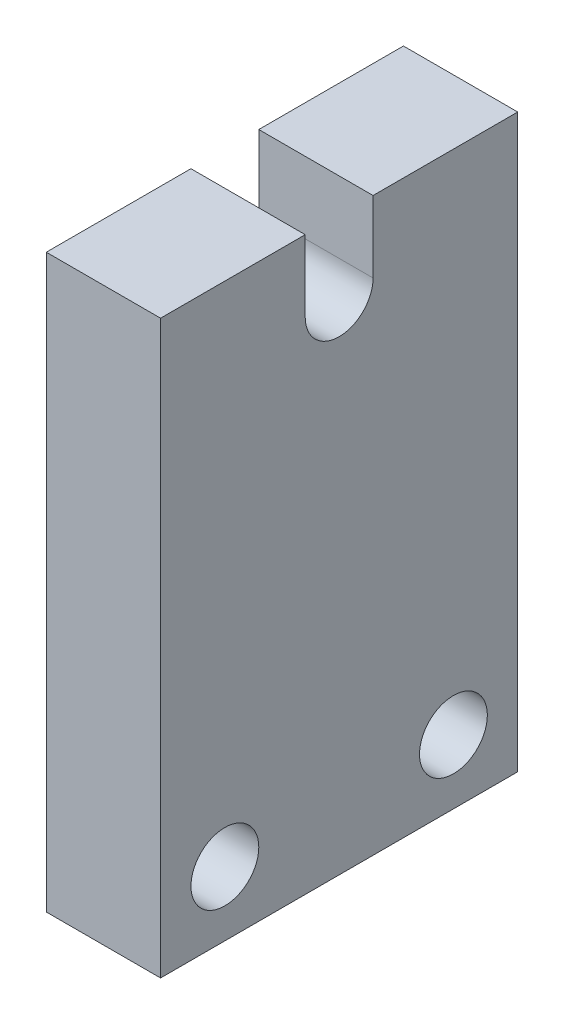
ISO-10303-21;
HEADER;
FILE_DESCRIPTION(('STEP AP214'),'2;1');
FILE_NAME('part.step','',(''),(''),'','','');
FILE_SCHEMA(('AUTOMOTIVE_DESIGN { 1 0 10303 214 1 1 1 1 }'));
ENDSEC;
DATA;
#1=APPLICATION_CONTEXT('core data for automotive mechanical design processes');
#2=APPLICATION_PROTOCOL_DEFINITION('international standard','automotive_design',2000,#1);
#3=PRODUCT_CONTEXT('',#1,'mechanical');
#4=PRODUCT('Part','Part','',(#3));
#5=PRODUCT_RELATED_PRODUCT_CATEGORY('part','',(#4));
#6=PRODUCT_DEFINITION_FORMATION('','',#4);
#7=PRODUCT_DEFINITION_CONTEXT('part definition',#1,'design');
#8=PRODUCT_DEFINITION('design','',#6,#7);
#9=PRODUCT_DEFINITION_SHAPE('','',#8);
#10=(LENGTH_UNIT() NAMED_UNIT(*) SI_UNIT(.MILLI.,.METRE.));
#11=(NAMED_UNIT(*) PLANE_ANGLE_UNIT() SI_UNIT($,.RADIAN.));
#12=(NAMED_UNIT(*) SI_UNIT($,.STERADIAN.) SOLID_ANGLE_UNIT());
#13=UNCERTAINTY_MEASURE_WITH_UNIT(LENGTH_MEASURE(1.E-05),#10,'distance_accuracy_value','');
#14=(GEOMETRIC_REPRESENTATION_CONTEXT(3) GLOBAL_UNCERTAINTY_ASSIGNED_CONTEXT((#13)) GLOBAL_UNIT_ASSIGNED_CONTEXT((#10,
#11,#12)) REPRESENTATION_CONTEXT('',''));
#15=CARTESIAN_POINT('',(0.,0.,0.));
#16=DIRECTION('',(0.,0.,1.));
#17=DIRECTION('',(1.,0.,0.));
#18=AXIS2_PLACEMENT_3D('',#15,#16,#17);
#19=CARTESIAN_POINT('',(8.,0.,0.));
#20=DIRECTION('',(1.,0.,0.));
#21=DIRECTION('',(0.,0.,-1.));
#22=AXIS2_PLACEMENT_3D('',#19,#20,#21);
#23=PLANE('',#22);
#24=CARTESIAN_POINT('',(8.,9.,16.));
#25=DIRECTION('',(1.,0.,0.));
#26=DIRECTION('',(0.,0.,-1.));
#27=AXIS2_PLACEMENT_3D('',#24,#25,#26);
#28=CIRCLE('',#27,4.75);
#29=CARTESIAN_POINT('',(8.,9.,11.25));
#30=VERTEX_POINT('',#29);
#31=EDGE_CURVE('E146',#30,#30,#28,.F.);
#32=ORIENTED_EDGE('',*,*,#31,.T.);
#33=EDGE_LOOP('',(#32));
#34=FACE_BOUND('',#33,.T.);
#35=CARTESIAN_POINT('',(8.,9.,-16.));
#36=DIRECTION('',(1.,0.,0.));
#37=DIRECTION('',(0.,0.,-1.));
#38=AXIS2_PLACEMENT_3D('',#35,#36,#37);
#39=CIRCLE('',#38,4.75);
#40=CARTESIAN_POINT('',(8.,9.,-20.75));
#41=VERTEX_POINT('',#40);
#42=EDGE_CURVE('E144',#41,#41,#39,.F.);
#43=ORIENTED_EDGE('',*,*,#42,.T.);
#44=EDGE_LOOP('',(#43));
#45=FACE_BOUND('',#44,.T.);
#46=DIRECTION('',(0.,1.,0.));
#47=VECTOR('',#46,1.);
#48=CARTESIAN_POINT('',(8.,70.,-4.75));
#49=LINE('',#48,#47);
#50=CARTESIAN_POINT('',(8.,80.,-4.75));
#51=VERTEX_POINT('',#50);
#52=CARTESIAN_POINT('',(8.,70.,-4.75));
#53=VERTEX_POINT('',#52);
#54=EDGE_CURVE('E48',#51,#53,#49,.F.);
#55=ORIENTED_EDGE('',*,*,#54,.T.);
#56=CARTESIAN_POINT('',(8.,70.,0.));
#57=DIRECTION('',(1.,0.,0.));
#58=DIRECTION('',(0.,0.,-1.));
#59=AXIS2_PLACEMENT_3D('',#56,#57,#58);
#60=CIRCLE('',#59,4.75);
#61=CARTESIAN_POINT('',(8.,70.,4.75));
#62=VERTEX_POINT('',#61);
#63=EDGE_CURVE('E20',#53,#62,#60,.F.);
#64=ORIENTED_EDGE('',*,*,#63,.T.);
#65=DIRECTION('',(0.,1.,0.));
#66=VECTOR('',#65,1.);
#67=CARTESIAN_POINT('',(8.,80.,4.75));
#68=LINE('',#67,#66);
#69=CARTESIAN_POINT('',(8.,80.,4.75));
#70=VERTEX_POINT('',#69);
#71=EDGE_CURVE('E95',#62,#70,#68,.T.);
#72=ORIENTED_EDGE('',*,*,#71,.T.);
#73=DIRECTION('',(0.,0.,1.));
#74=VECTOR('',#73,1.);
#75=CARTESIAN_POINT('',(8.,80.,-25.));
#76=LINE('',#75,#74);
#77=CARTESIAN_POINT('',(8.,80.,25.));
#78=VERTEX_POINT('',#77);
#79=EDGE_CURVE('E92',#78,#70,#76,.F.);
#80=ORIENTED_EDGE('',*,*,#79,.F.);
#81=DIRECTION('',(0.,1.,0.));
#82=VECTOR('',#81,1.);
#83=CARTESIAN_POINT('',(8.,80.,25.));
#84=LINE('',#83,#82);
#85=CARTESIAN_POINT('',(8.,0.,25.));
#86=VERTEX_POINT('',#85);
#87=EDGE_CURVE('E83',#86,#78,#84,.T.);
#88=ORIENTED_EDGE('',*,*,#87,.F.);
#89=DIRECTION('',(0.,0.,-1.));
#90=VECTOR('',#89,1.);
#91=CARTESIAN_POINT('',(8.,0.,25.));
#92=LINE('',#91,#90);
#93=CARTESIAN_POINT('',(8.,0.,-25.));
#94=VERTEX_POINT('',#93);
#95=EDGE_CURVE('E104',#94,#86,#92,.F.);
#96=ORIENTED_EDGE('',*,*,#95,.F.);
#97=DIRECTION('',(0.,1.,0.));
#98=VECTOR('',#97,1.);
#99=CARTESIAN_POINT('',(8.,0.,-25.));
#100=LINE('',#99,#98);
#101=CARTESIAN_POINT('',(8.,80.,-25.));
#102=VERTEX_POINT('',#101);
#103=EDGE_CURVE('E129',#102,#94,#100,.F.);
#104=ORIENTED_EDGE('',*,*,#103,.F.);
#105=DIRECTION('',(0.,0.,1.));
#106=VECTOR('',#105,1.);
#107=CARTESIAN_POINT('',(8.,80.,-25.));
#108=LINE('',#107,#106);
#109=EDGE_CURVE('E55',#51,#102,#108,.F.);
#110=ORIENTED_EDGE('',*,*,#109,.F.);
#111=EDGE_LOOP('',(#55,#64,#72,#80,#88,#96,#104,#110));
#112=FACE_BOUND('',#111,.T.);
#113=ADVANCED_FACE('F17',(#34,#45,#112),#23,.T.);
#114=CARTESIAN_POINT('',(8.,80.,-25.));
#115=DIRECTION('',(0.,1.,0.));
#116=DIRECTION('',(0.,0.,1.));
#117=AXIS2_PLACEMENT_3D('',#114,#115,#116);
#118=PLANE('',#117);
#119=DIRECTION('',(1.,0.,0.));
#120=VECTOR('',#119,1.);
#121=CARTESIAN_POINT('',(8.,80.,25.));
#122=LINE('',#121,#120);
#123=CARTESIAN_POINT('',(-8.,80.,25.));
#124=VERTEX_POINT('',#123);
#125=EDGE_CURVE('E88',#78,#124,#122,.F.);
#126=ORIENTED_EDGE('',*,*,#125,.F.);
#127=ORIENTED_EDGE('',*,*,#79,.T.);
#128=DIRECTION('',(1.,0.,0.));
#129=VECTOR('',#128,1.);
#130=CARTESIAN_POINT('',(8.,80.,4.75));
#131=LINE('',#130,#129);
#132=CARTESIAN_POINT('',(-8.,80.,4.75));
#133=VERTEX_POINT('',#132);
#134=EDGE_CURVE('E116',#70,#133,#131,.F.);
#135=ORIENTED_EDGE('',*,*,#134,.T.);
#136=DIRECTION('',(0.,0.,-1.));
#137=VECTOR('',#136,1.);
#138=CARTESIAN_POINT('',(-8.,80.,0.));
#139=LINE('',#138,#137);
#140=EDGE_CURVE('E103',#133,#124,#139,.F.);
#141=ORIENTED_EDGE('',*,*,#140,.T.);
#142=EDGE_LOOP('',(#126,#127,#135,#141));
#143=FACE_BOUND('',#142,.T.);
#144=ADVANCED_FACE('F101',(#143),#118,.T.);
#145=CARTESIAN_POINT('',(8.,80.,25.));
#146=DIRECTION('',(0.,0.,1.));
#147=DIRECTION('',(1.,0.,0.));
#148=AXIS2_PLACEMENT_3D('',#145,#146,#147);
#149=PLANE('',#148);
#150=ORIENTED_EDGE('',*,*,#87,.T.);
#151=ORIENTED_EDGE('',*,*,#125,.T.);
#152=DIRECTION('',(0.,1.,0.));
#153=VECTOR('',#152,1.);
#154=CARTESIAN_POINT('',(-8.,0.,25.));
#155=LINE('',#154,#153);
#156=CARTESIAN_POINT('',(-8.,0.,25.));
#157=VERTEX_POINT('',#156);
#158=EDGE_CURVE('E157',#124,#157,#155,.F.);
#159=ORIENTED_EDGE('',*,*,#158,.T.);
#160=DIRECTION('',(1.,0.,0.));
#161=VECTOR('',#160,1.);
#162=CARTESIAN_POINT('',(8.,0.,25.));
#163=LINE('',#162,#161);
#164=EDGE_CURVE('E90',#86,#157,#163,.F.);
#165=ORIENTED_EDGE('',*,*,#164,.F.);
#166=EDGE_LOOP('',(#150,#151,#159,#165));
#167=FACE_BOUND('',#166,.T.);
#168=ADVANCED_FACE('F85',(#167),#149,.T.);
#169=CARTESIAN_POINT('',(8.,0.,25.));
#170=DIRECTION('',(0.,-1.,0.));
#171=DIRECTION('',(0.,0.,-1.));
#172=AXIS2_PLACEMENT_3D('',#169,#170,#171);
#173=PLANE('',#172);
#174=ORIENTED_EDGE('',*,*,#95,.T.);
#175=ORIENTED_EDGE('',*,*,#164,.T.);
#176=DIRECTION('',(0.,0.,-1.));
#177=VECTOR('',#176,1.);
#178=CARTESIAN_POINT('',(-8.,0.,0.));
#179=LINE('',#178,#177);
#180=CARTESIAN_POINT('',(-8.,0.,-25.));
#181=VERTEX_POINT('',#180);
#182=EDGE_CURVE('E178',#157,#181,#179,.T.);
#183=ORIENTED_EDGE('',*,*,#182,.T.);
#184=DIRECTION('',(-1.,0.,0.));
#185=VECTOR('',#184,1.);
#186=CARTESIAN_POINT('',(8.,0.,-25.));
#187=LINE('',#186,#185);
#188=EDGE_CURVE('E126',#94,#181,#187,.T.);
#189=ORIENTED_EDGE('',*,*,#188,.F.);
#190=EDGE_LOOP('',(#174,#175,#183,#189));
#191=FACE_BOUND('',#190,.T.);
#192=ADVANCED_FACE('F198',(#191),#173,.T.);
#193=CARTESIAN_POINT('',(8.,0.,-25.));
#194=DIRECTION('',(0.,0.,-1.));
#195=DIRECTION('',(-1.,0.,0.));
#196=AXIS2_PLACEMENT_3D('',#193,#194,#195);
#197=PLANE('',#196);
#198=ORIENTED_EDGE('',*,*,#103,.T.);
#199=ORIENTED_EDGE('',*,*,#188,.T.);
#200=DIRECTION('',(0.,1.,0.));
#201=VECTOR('',#200,1.);
#202=CARTESIAN_POINT('',(-8.,0.,-25.));
#203=LINE('',#202,#201);
#204=CARTESIAN_POINT('',(-8.,80.,-25.));
#205=VERTEX_POINT('',#204);
#206=EDGE_CURVE('E169',#181,#205,#203,.T.);
#207=ORIENTED_EDGE('',*,*,#206,.T.);
#208=DIRECTION('',(1.,0.,0.));
#209=VECTOR('',#208,1.);
#210=CARTESIAN_POINT('',(8.,80.,-25.));
#211=LINE('',#210,#209);
#212=EDGE_CURVE('E125',#102,#205,#211,.F.);
#213=ORIENTED_EDGE('',*,*,#212,.F.);
#214=EDGE_LOOP('',(#198,#199,#207,#213));
#215=FACE_BOUND('',#214,.T.);
#216=ADVANCED_FACE('F201',(#215),#197,.T.);
#217=CARTESIAN_POINT('',(8.,80.,-25.));
#218=DIRECTION('',(0.,1.,0.));
#219=DIRECTION('',(0.,0.,1.));
#220=AXIS2_PLACEMENT_3D('',#217,#218,#219);
#221=PLANE('',#220);
#222=ORIENTED_EDGE('',*,*,#212,.T.);
#223=DIRECTION('',(0.,0.,-1.));
#224=VECTOR('',#223,1.);
#225=CARTESIAN_POINT('',(-8.,80.,0.));
#226=LINE('',#225,#224);
#227=CARTESIAN_POINT('',(-8.,80.,-4.75));
#228=VERTEX_POINT('',#227);
#229=EDGE_CURVE('E166',#205,#228,#226,.F.);
#230=ORIENTED_EDGE('',*,*,#229,.T.);
#231=DIRECTION('',(-1.,0.,0.));
#232=VECTOR('',#231,1.);
#233=CARTESIAN_POINT('',(8.,80.,-4.75));
#234=LINE('',#233,#232);
#235=EDGE_CURVE('E121',#228,#51,#234,.F.);
#236=ORIENTED_EDGE('',*,*,#235,.T.);
#237=ORIENTED_EDGE('',*,*,#109,.T.);
#238=EDGE_LOOP('',(#222,#230,#236,#237));
#239=FACE_BOUND('',#238,.T.);
#240=ADVANCED_FACE('F203',(#239),#221,.T.);
#241=CARTESIAN_POINT('',(8.,70.,-4.75));
#242=DIRECTION('',(0.,0.,-1.));
#243=DIRECTION('',(-1.,0.,0.));
#244=AXIS2_PLACEMENT_3D('',#241,#242,#243);
#245=PLANE('',#244);
#246=DIRECTION('',(1.,0.,0.));
#247=VECTOR('',#246,1.);
#248=CARTESIAN_POINT('',(8.,70.,-4.75));
#249=LINE('',#248,#247);
#250=CARTESIAN_POINT('',(-8.,70.,-4.75));
#251=VERTEX_POINT('',#250);
#252=EDGE_CURVE('E120',#251,#53,#249,.T.);
#253=ORIENTED_EDGE('',*,*,#252,.T.);
#254=ORIENTED_EDGE('',*,*,#54,.F.);
#255=ORIENTED_EDGE('',*,*,#235,.F.);
#256=DIRECTION('',(0.,1.,0.));
#257=VECTOR('',#256,1.);
#258=CARTESIAN_POINT('',(-8.,0.,-4.75));
#259=LINE('',#258,#257);
#260=EDGE_CURVE('E143',#228,#251,#259,.F.);
#261=ORIENTED_EDGE('',*,*,#260,.T.);
#262=EDGE_LOOP('',(#253,#254,#255,#261));
#263=FACE_BOUND('',#262,.T.);
#264=ADVANCED_FACE('F217',(#263),#245,.F.);
#265=CARTESIAN_POINT('',(8.,70.,0.));
#266=DIRECTION('',(1.,0.,0.));
#267=DIRECTION('',(0.,0.,-1.));
#268=AXIS2_PLACEMENT_3D('',#265,#266,#267);
#269=CYLINDRICAL_SURFACE('',#268,4.75);
#270=DIRECTION('',(1.,0.,0.));
#271=VECTOR('',#270,1.);
#272=CARTESIAN_POINT('',(8.,70.,4.75));
#273=LINE('',#272,#271);
#274=CARTESIAN_POINT('',(-8.,70.,4.75));
#275=VERTEX_POINT('',#274);
#276=EDGE_CURVE('E35',#275,#62,#273,.T.);
#277=ORIENTED_EDGE('',*,*,#276,.T.);
#278=ORIENTED_EDGE('',*,*,#63,.F.);
#279=ORIENTED_EDGE('',*,*,#252,.F.);
#280=CARTESIAN_POINT('',(-8.,70.,0.));
#281=DIRECTION('',(1.,0.,0.));
#282=DIRECTION('',(0.,0.,-1.));
#283=AXIS2_PLACEMENT_3D('',#280,#281,#282);
#284=CIRCLE('',#283,4.75);
#285=EDGE_CURVE('E140',#251,#275,#284,.F.);
#286=ORIENTED_EDGE('',*,*,#285,.T.);
#287=EDGE_LOOP('',(#277,#278,#279,#286));
#288=FACE_BOUND('',#287,.T.);
#289=ADVANCED_FACE('F216',(#288),#269,.F.);
#290=CARTESIAN_POINT('',(8.,80.,4.75));
#291=DIRECTION('',(0.,0.,1.));
#292=DIRECTION('',(1.,0.,0.));
#293=AXIS2_PLACEMENT_3D('',#290,#291,#292);
#294=PLANE('',#293);
#295=ORIENTED_EDGE('',*,*,#134,.F.);
#296=ORIENTED_EDGE('',*,*,#71,.F.);
#297=ORIENTED_EDGE('',*,*,#276,.F.);
#298=DIRECTION('',(0.,1.,0.));
#299=VECTOR('',#298,1.);
#300=CARTESIAN_POINT('',(-8.,0.,4.75));
#301=LINE('',#300,#299);
#302=EDGE_CURVE('E139',#275,#133,#301,.T.);
#303=ORIENTED_EDGE('',*,*,#302,.T.);
#304=EDGE_LOOP('',(#295,#296,#297,#303));
#305=FACE_BOUND('',#304,.T.);
#306=ADVANCED_FACE('F213',(#305),#294,.F.);
#307=CARTESIAN_POINT('',(8.,9.,16.));
#308=DIRECTION('',(1.,0.,0.));
#309=DIRECTION('',(0.,0.,-1.));
#310=AXIS2_PLACEMENT_3D('',#307,#308,#309);
#311=CYLINDRICAL_SURFACE('',#310,4.75);
#312=ORIENTED_EDGE('',*,*,#31,.F.);
#313=EDGE_LOOP('',(#312));
#314=FACE_BOUND('',#313,.T.);
#315=CARTESIAN_POINT('',(-8.,9.,16.));
#316=DIRECTION('',(1.,0.,0.));
#317=DIRECTION('',(0.,0.,-1.));
#318=AXIS2_PLACEMENT_3D('',#315,#316,#317);
#319=CIRCLE('',#318,4.75);
#320=CARTESIAN_POINT('',(-8.,9.,11.25));
#321=VERTEX_POINT('',#320);
#322=EDGE_CURVE('E26',#321,#321,#319,.F.);
#323=ORIENTED_EDGE('',*,*,#322,.T.);
#324=EDGE_LOOP('',(#323));
#325=FACE_BOUND('',#324,.T.);
#326=ADVANCED_FACE('F234',(#314,#325),#311,.F.);
#327=CARTESIAN_POINT('',(8.,9.,-16.));
#328=DIRECTION('',(1.,0.,0.));
#329=DIRECTION('',(0.,0.,-1.));
#330=AXIS2_PLACEMENT_3D('',#327,#328,#329);
#331=CYLINDRICAL_SURFACE('',#330,4.75);
#332=ORIENTED_EDGE('',*,*,#42,.F.);
#333=EDGE_LOOP('',(#332));
#334=FACE_BOUND('',#333,.T.);
#335=CARTESIAN_POINT('',(-8.,9.,-16.));
#336=DIRECTION('',(1.,0.,0.));
#337=DIRECTION('',(0.,0.,-1.));
#338=AXIS2_PLACEMENT_3D('',#335,#336,#337);
#339=CIRCLE('',#338,4.75);
#340=CARTESIAN_POINT('',(-8.,9.,-20.75));
#341=VERTEX_POINT('',#340);
#342=EDGE_CURVE('E11',#341,#341,#339,.F.);
#343=ORIENTED_EDGE('',*,*,#342,.T.);
#344=EDGE_LOOP('',(#343));
#345=FACE_BOUND('',#344,.T.);
#346=ADVANCED_FACE('F228',(#334,#345),#331,.F.);
#347=CARTESIAN_POINT('',(-8.,0.,0.));
#348=DIRECTION('',(1.,0.,0.));
#349=DIRECTION('',(0.,0.,-1.));
#350=AXIS2_PLACEMENT_3D('',#347,#348,#349);
#351=PLANE('',#350);
#352=ORIENTED_EDGE('',*,*,#342,.F.);
#353=EDGE_LOOP('',(#352));
#354=FACE_BOUND('',#353,.T.);
#355=ORIENTED_EDGE('',*,*,#322,.F.);
#356=EDGE_LOOP('',(#355));
#357=FACE_BOUND('',#356,.T.);
#358=ORIENTED_EDGE('',*,*,#285,.F.);
#359=ORIENTED_EDGE('',*,*,#260,.F.);
#360=ORIENTED_EDGE('',*,*,#229,.F.);
#361=ORIENTED_EDGE('',*,*,#206,.F.);
#362=ORIENTED_EDGE('',*,*,#182,.F.);
#363=ORIENTED_EDGE('',*,*,#158,.F.);
#364=ORIENTED_EDGE('',*,*,#140,.F.);
#365=ORIENTED_EDGE('',*,*,#302,.F.);
#366=EDGE_LOOP('',(#358,#359,#360,#361,#362,#363,#364,#365));
#367=FACE_BOUND('',#366,.T.);
#368=ADVANCED_FACE('F193',(#354,#357,#367),#351,.F.);
#369=CLOSED_SHELL('',(#113,#144,#168,#192,#216,#240,#264,#289,#306,#326,#346,#368));
#370=MANIFOLD_SOLID_BREP('B1',#369);
#371=ADVANCED_BREP_SHAPE_REPRESENTATION('',(#18,#370),#14);
#372=SHAPE_DEFINITION_REPRESENTATION(#9,#371);
ENDSEC;
END-ISO-10303-21;
